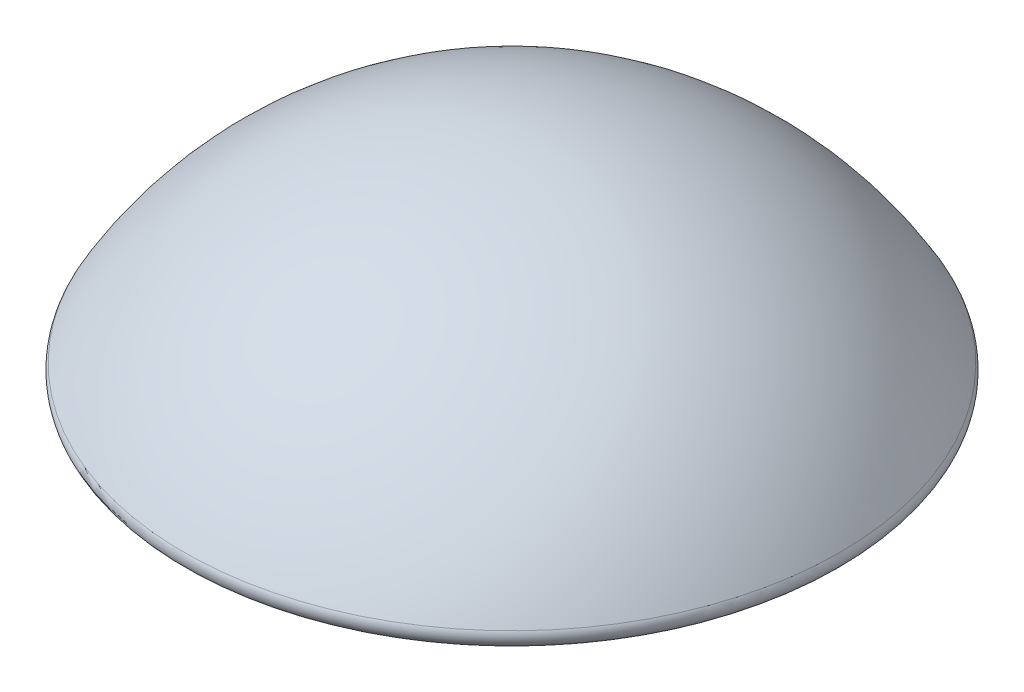
ISO-10303-21;
HEADER;
FILE_DESCRIPTION(('STEP AP214'),'2;1');
FILE_NAME('part.step','',(''),(''),'','','');
FILE_SCHEMA(('AUTOMOTIVE_DESIGN { 1 0 10303 214 1 1 1 1 }'));
ENDSEC;
DATA;
#1=APPLICATION_CONTEXT('core data for automotive mechanical design processes');
#2=APPLICATION_PROTOCOL_DEFINITION('international standard','automotive_design',2000,#1);
#3=PRODUCT_CONTEXT('',#1,'mechanical');
#4=PRODUCT('Part','Part','',(#3));
#5=PRODUCT_RELATED_PRODUCT_CATEGORY('part','',(#4));
#6=PRODUCT_DEFINITION_FORMATION('','',#4);
#7=PRODUCT_DEFINITION_CONTEXT('part definition',#1,'design');
#8=PRODUCT_DEFINITION('design','',#6,#7);
#9=PRODUCT_DEFINITION_SHAPE('','',#8);
#10=(LENGTH_UNIT() NAMED_UNIT(*) SI_UNIT(.MILLI.,.METRE.));
#11=(NAMED_UNIT(*) PLANE_ANGLE_UNIT() SI_UNIT($,.RADIAN.));
#12=(NAMED_UNIT(*) SI_UNIT($,.STERADIAN.) SOLID_ANGLE_UNIT());
#13=UNCERTAINTY_MEASURE_WITH_UNIT(LENGTH_MEASURE(1.E-05),#10,'distance_accuracy_value','');
#14=(GEOMETRIC_REPRESENTATION_CONTEXT(3) GLOBAL_UNCERTAINTY_ASSIGNED_CONTEXT((#13)) GLOBAL_UNIT_ASSIGNED_CONTEXT((#10,
#11,#12)) REPRESENTATION_CONTEXT('',''));
#15=CARTESIAN_POINT('',(0.,0.,0.));
#16=DIRECTION('',(0.,0.,1.));
#17=DIRECTION('',(1.,0.,0.));
#18=AXIS2_PLACEMENT_3D('',#15,#16,#17);
#19=CARTESIAN_POINT('',(0.,0.,0.));
#20=DIRECTION('',(0.,1.,0.));
#21=DIRECTION('',(1.,0.,0.));
#22=AXIS2_PLACEMENT_3D('',#19,#20,#21);
#23=SPHERICAL_SURFACE('',#22,95.25);
#24=CARTESIAN_POINT('',(0.,47.6250000000001,0.));
#25=DIRECTION('',(0.,1.,0.));
#26=DIRECTION('',(-1.,0.,0.));
#27=AXIS2_PLACEMENT_3D('',#24,#25,#26);
#28=CIRCLE('',#27,82.4889197104678);
#29=CARTESIAN_POINT('',(-82.4889197104678,47.6250000000001,0.));
#30=VERTEX_POINT('',#29);
#31=EDGE_CURVE('E10',#30,#30,#28,.T.);
#32=ORIENTED_EDGE('',*,*,#31,.F.);
#33=EDGE_LOOP('',(#32));
#34=FACE_BOUND('',#33,.T.);
#35=ADVANCED_FACE('F37',(#34),#23,.F.);
#36=CARTESIAN_POINT('',(0.,49.2125000000001,0.));
#37=DIRECTION('',(0.,1.,0.));
#38=DIRECTION('',(-1.,0.,0.));
#39=AXIS2_PLACEMENT_3D('',#36,#37,#38);
#40=TOROIDAL_SURFACE('',#39,85.2385503674833,3.17499999999999);
#41=CARTESIAN_POINT('',(0.,50.8000000000001,0.));
#42=DIRECTION('',(0.,1.,0.));
#43=DIRECTION('',(-1.,0.,0.));
#44=AXIS2_PLACEMENT_3D('',#41,#42,#43);
#45=CIRCLE('',#44,87.9881810244989);
#46=CARTESIAN_POINT('',(-87.9881810244989,50.8,0.));
#47=VERTEX_POINT('',#46);
#48=EDGE_CURVE('E43',#47,#47,#45,.T.);
#49=ORIENTED_EDGE('',*,*,#48,.F.);
#50=EDGE_LOOP('',(#49));
#51=FACE_BOUND('',#50,.T.);
#52=ORIENTED_EDGE('',*,*,#31,.T.);
#53=EDGE_LOOP('',(#52));
#54=FACE_BOUND('',#53,.T.);
#55=ADVANCED_FACE('F51',(#51,#54),#40,.T.);
#56=CARTESIAN_POINT('',(0.,0.,0.));
#57=DIRECTION('',(0.,1.,0.));
#58=DIRECTION('',(1.,0.,0.));
#59=AXIS2_PLACEMENT_3D('',#56,#57,#58);
#60=SPHERICAL_SURFACE('',#59,101.6);
#61=ORIENTED_EDGE('',*,*,#48,.T.);
#62=EDGE_LOOP('',(#61));
#63=FACE_BOUND('',#62,.T.);
#64=ADVANCED_FACE('F49',(#63),#60,.T.);
#65=CLOSED_SHELL('',(#35,#55,#64));
#66=MANIFOLD_SOLID_BREP('B2',#65);
#67=ADVANCED_BREP_SHAPE_REPRESENTATION('',(#18,#66),#14);
#68=SHAPE_DEFINITION_REPRESENTATION(#9,#67);
ENDSEC;
END-ISO-10303-21;
